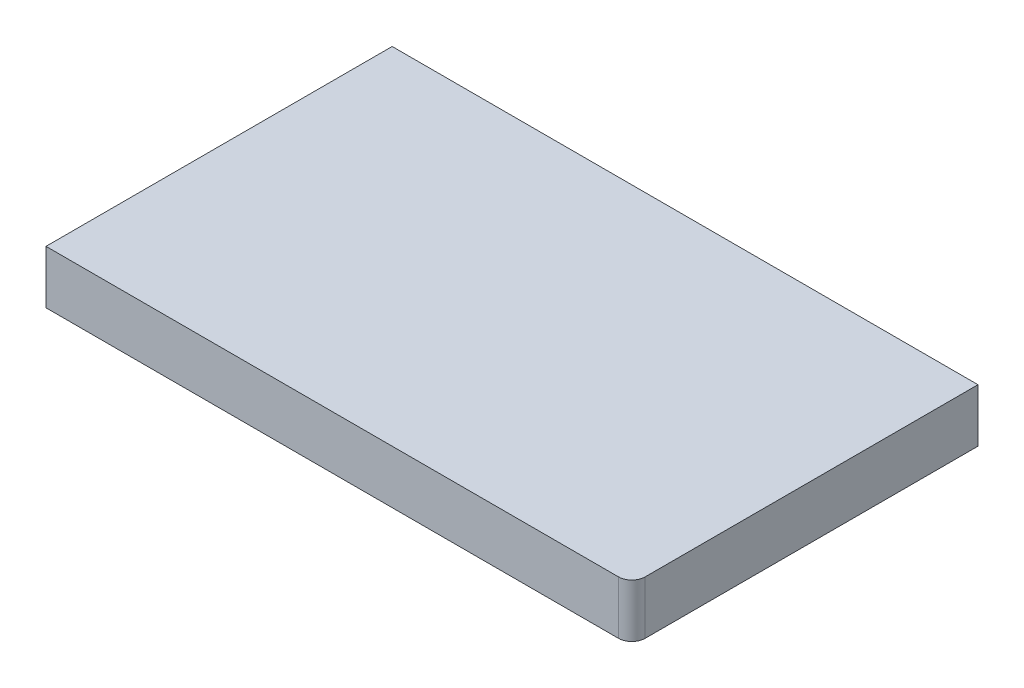
ISO-10303-21;
HEADER;
FILE_DESCRIPTION(('STEP AP214'),'2;1');
FILE_NAME('part.step','',(''),(''),'','','');
FILE_SCHEMA(('AUTOMOTIVE_DESIGN { 1 0 10303 214 1 1 1 1 }'));
ENDSEC;
DATA;
#1=APPLICATION_CONTEXT('core data for automotive mechanical design processes');
#2=APPLICATION_PROTOCOL_DEFINITION('international standard','automotive_design',2000,#1);
#3=PRODUCT_CONTEXT('',#1,'mechanical');
#4=PRODUCT('Part','Part','',(#3));
#5=PRODUCT_RELATED_PRODUCT_CATEGORY('part','',(#4));
#6=PRODUCT_DEFINITION_FORMATION('','',#4);
#7=PRODUCT_DEFINITION_CONTEXT('part definition',#1,'design');
#8=PRODUCT_DEFINITION('design','',#6,#7);
#9=PRODUCT_DEFINITION_SHAPE('','',#8);
#10=(LENGTH_UNIT() NAMED_UNIT(*) SI_UNIT(.MILLI.,.METRE.));
#11=(NAMED_UNIT(*) PLANE_ANGLE_UNIT() SI_UNIT($,.RADIAN.));
#12=(NAMED_UNIT(*) SI_UNIT($,.STERADIAN.) SOLID_ANGLE_UNIT());
#13=UNCERTAINTY_MEASURE_WITH_UNIT(LENGTH_MEASURE(1.E-05),#10,'distance_accuracy_value','');
#14=(GEOMETRIC_REPRESENTATION_CONTEXT(3) GLOBAL_UNCERTAINTY_ASSIGNED_CONTEXT((#13)) GLOBAL_UNIT_ASSIGNED_CONTEXT((#10,
#11,#12)) REPRESENTATION_CONTEXT('',''));
#15=CARTESIAN_POINT('',(0.,0.,0.));
#16=DIRECTION('',(0.,0.,1.));
#17=DIRECTION('',(1.,0.,0.));
#18=AXIS2_PLACEMENT_3D('',#15,#16,#17);
#19=CARTESIAN_POINT('',(11.,1.,6.5));
#20=DIRECTION('',(-1.,0.,0.));
#21=DIRECTION('',(0.,0.,1.));
#22=AXIS2_PLACEMENT_3D('',#19,#20,#21);
#23=PLANE('',#22);
#24=DIRECTION('',(0.,0.,-1.));
#25=VECTOR('',#24,1.);
#26=CARTESIAN_POINT('',(11.,1.,6.5));
#27=LINE('',#26,#25);
#28=CARTESIAN_POINT('',(11.,1.,6.));
#29=VERTEX_POINT('',#28);
#30=CARTESIAN_POINT('',(11.,1.,-6.5));
#31=VERTEX_POINT('',#30);
#32=EDGE_CURVE('E78',#29,#31,#27,.T.);
#33=ORIENTED_EDGE('',*,*,#32,.F.);
#34=DIRECTION('',(0.,-1.,0.));
#35=VECTOR('',#34,1.);
#36=CARTESIAN_POINT('',(11.,1.,6.));
#37=LINE('',#36,#35);
#38=CARTESIAN_POINT('',(11.,-1.,6.));
#39=VERTEX_POINT('',#38);
#40=EDGE_CURVE('E101',#29,#39,#37,.T.);
#41=ORIENTED_EDGE('',*,*,#40,.T.);
#42=DIRECTION('',(0.,0.,-1.));
#43=VECTOR('',#42,1.);
#44=CARTESIAN_POINT('',(11.,-1.,6.5));
#45=LINE('',#44,#43);
#46=CARTESIAN_POINT('',(11.,-1.,-6.5));
#47=VERTEX_POINT('',#46);
#48=EDGE_CURVE('E99',#39,#47,#45,.T.);
#49=ORIENTED_EDGE('',*,*,#48,.T.);
#50=DIRECTION('',(0.,-1.,0.));
#51=VECTOR('',#50,1.);
#52=CARTESIAN_POINT('',(11.,1.,-6.5));
#53=LINE('',#52,#51);
#54=EDGE_CURVE('E93',#31,#47,#53,.T.);
#55=ORIENTED_EDGE('',*,*,#54,.F.);
#56=EDGE_LOOP('',(#33,#41,#49,#55));
#57=FACE_BOUND('',#56,.T.);
#58=ADVANCED_FACE('F32',(#57),#23,.F.);
#59=CARTESIAN_POINT('',(-11.,1.,-6.5));
#60=DIRECTION('',(0.,0.,1.));
#61=DIRECTION('',(1.,0.,0.));
#62=AXIS2_PLACEMENT_3D('',#59,#60,#61);
#63=PLANE('',#62);
#64=DIRECTION('',(-1.,0.,0.));
#65=VECTOR('',#64,1.);
#66=CARTESIAN_POINT('',(-11.,-1.,-6.5));
#67=LINE('',#66,#65);
#68=CARTESIAN_POINT('',(-11.,-1.,-6.5));
#69=VERTEX_POINT('',#68);
#70=EDGE_CURVE('E114',#47,#69,#67,.T.);
#71=ORIENTED_EDGE('',*,*,#70,.T.);
#72=DIRECTION('',(0.,-1.,0.));
#73=VECTOR('',#72,1.);
#74=CARTESIAN_POINT('',(-11.,1.,-6.5));
#75=LINE('',#74,#73);
#76=CARTESIAN_POINT('',(-11.,1.,-6.5));
#77=VERTEX_POINT('',#76);
#78=EDGE_CURVE('E95',#77,#69,#75,.T.);
#79=ORIENTED_EDGE('',*,*,#78,.F.);
#80=DIRECTION('',(-1.,0.,0.));
#81=VECTOR('',#80,1.);
#82=CARTESIAN_POINT('',(-11.,1.,-6.5));
#83=LINE('',#82,#81);
#84=EDGE_CURVE('E81',#31,#77,#83,.T.);
#85=ORIENTED_EDGE('',*,*,#84,.F.);
#86=ORIENTED_EDGE('',*,*,#54,.T.);
#87=EDGE_LOOP('',(#71,#79,#85,#86));
#88=FACE_BOUND('',#87,.T.);
#89=ADVANCED_FACE('F92',(#88),#63,.F.);
#90=CARTESIAN_POINT('',(-11.,1.,6.5));
#91=DIRECTION('',(1.,0.,0.));
#92=DIRECTION('',(0.,0.,-1.));
#93=AXIS2_PLACEMENT_3D('',#90,#91,#92);
#94=PLANE('',#93);
#95=DIRECTION('',(0.,0.,1.));
#96=VECTOR('',#95,1.);
#97=CARTESIAN_POINT('',(-11.,-1.,6.5));
#98=LINE('',#97,#96);
#99=CARTESIAN_POINT('',(-11.,-1.,6.5));
#100=VERTEX_POINT('',#99);
#101=EDGE_CURVE('E112',#69,#100,#98,.T.);
#102=ORIENTED_EDGE('',*,*,#101,.T.);
#103=DIRECTION('',(0.,-1.,0.));
#104=VECTOR('',#103,1.);
#105=CARTESIAN_POINT('',(-11.,1.,6.5));
#106=LINE('',#105,#104);
#107=CARTESIAN_POINT('',(-11.,1.,6.5));
#108=VERTEX_POINT('',#107);
#109=EDGE_CURVE('E104',#108,#100,#106,.T.);
#110=ORIENTED_EDGE('',*,*,#109,.F.);
#111=DIRECTION('',(0.,0.,1.));
#112=VECTOR('',#111,1.);
#113=CARTESIAN_POINT('',(-11.,1.,6.5));
#114=LINE('',#113,#112);
#115=EDGE_CURVE('E97',#77,#108,#114,.T.);
#116=ORIENTED_EDGE('',*,*,#115,.F.);
#117=ORIENTED_EDGE('',*,*,#78,.T.);
#118=EDGE_LOOP('',(#102,#110,#116,#117));
#119=FACE_BOUND('',#118,.T.);
#120=ADVANCED_FACE('F120',(#119),#94,.F.);
#121=CARTESIAN_POINT('',(-11.,1.,6.5));
#122=DIRECTION('',(0.,0.,-1.));
#123=DIRECTION('',(-1.,0.,0.));
#124=AXIS2_PLACEMENT_3D('',#121,#122,#123);
#125=PLANE('',#124);
#126=DIRECTION('',(1.,0.,0.));
#127=VECTOR('',#126,1.);
#128=CARTESIAN_POINT('',(-11.,-1.,6.5));
#129=LINE('',#128,#127);
#130=CARTESIAN_POINT('',(10.5,-1.,6.5));
#131=VERTEX_POINT('',#130);
#132=EDGE_CURVE('E88',#100,#131,#129,.T.);
#133=ORIENTED_EDGE('',*,*,#132,.T.);
#134=DIRECTION('',(0.,-1.,0.));
#135=VECTOR('',#134,1.);
#136=CARTESIAN_POINT('',(10.5,1.,6.5));
#137=LINE('',#136,#135);
#138=CARTESIAN_POINT('',(10.5,1.,6.5));
#139=VERTEX_POINT('',#138);
#140=EDGE_CURVE('E40',#131,#139,#137,.F.);
#141=ORIENTED_EDGE('',*,*,#140,.T.);
#142=DIRECTION('',(1.,0.,0.));
#143=VECTOR('',#142,1.);
#144=CARTESIAN_POINT('',(-11.,1.,6.5));
#145=LINE('',#144,#143);
#146=EDGE_CURVE('E110',#108,#139,#145,.T.);
#147=ORIENTED_EDGE('',*,*,#146,.F.);
#148=ORIENTED_EDGE('',*,*,#109,.T.);
#149=EDGE_LOOP('',(#133,#141,#147,#148));
#150=FACE_BOUND('',#149,.T.);
#151=ADVANCED_FACE('F122',(#150),#125,.F.);
#152=CARTESIAN_POINT('',(0.,1.,0.));
#153=DIRECTION('',(0.,-1.,0.));
#154=DIRECTION('',(0.,0.,-1.));
#155=AXIS2_PLACEMENT_3D('',#152,#153,#154);
#156=PLANE('',#155);
#157=ORIENTED_EDGE('',*,*,#146,.T.);
#158=CARTESIAN_POINT('',(10.5,1.,6.));
#159=DIRECTION('',(0.,-1.,0.));
#160=DIRECTION('',(0.,0.,-1.));
#161=AXIS2_PLACEMENT_3D('',#158,#159,#160);
#162=CIRCLE('',#161,0.5);
#163=EDGE_CURVE('E11',#139,#29,#162,.F.);
#164=ORIENTED_EDGE('',*,*,#163,.T.);
#165=ORIENTED_EDGE('',*,*,#32,.T.);
#166=ORIENTED_EDGE('',*,*,#84,.T.);
#167=ORIENTED_EDGE('',*,*,#115,.T.);
#168=EDGE_LOOP('',(#157,#164,#165,#166,#167));
#169=FACE_BOUND('',#168,.T.);
#170=ADVANCED_FACE('F80',(#169),#156,.F.);
#171=CARTESIAN_POINT('',(0.,-1.,0.));
#172=DIRECTION('',(0.,-1.,0.));
#173=DIRECTION('',(0.,0.,-1.));
#174=AXIS2_PLACEMENT_3D('',#171,#172,#173);
#175=PLANE('',#174);
#176=ORIENTED_EDGE('',*,*,#48,.F.);
#177=CARTESIAN_POINT('',(10.5,-1.,6.));
#178=DIRECTION('',(0.,-1.,0.));
#179=DIRECTION('',(0.,0.,-1.));
#180=AXIS2_PLACEMENT_3D('',#177,#178,#179);
#181=CIRCLE('',#180,0.5);
#182=EDGE_CURVE('E54',#39,#131,#181,.T.);
#183=ORIENTED_EDGE('',*,*,#182,.T.);
#184=ORIENTED_EDGE('',*,*,#132,.F.);
#185=ORIENTED_EDGE('',*,*,#101,.F.);
#186=ORIENTED_EDGE('',*,*,#70,.F.);
#187=EDGE_LOOP('',(#176,#183,#184,#185,#186));
#188=FACE_BOUND('',#187,.T.);
#189=ADVANCED_FACE('F129',(#188),#175,.T.);
#190=CARTESIAN_POINT('',(10.5,1.,6.));
#191=DIRECTION('',(0.,-1.,0.));
#192=DIRECTION('',(0.,0.,-1.));
#193=AXIS2_PLACEMENT_3D('',#190,#191,#192);
#194=CYLINDRICAL_SURFACE('',#193,0.5);
#195=ORIENTED_EDGE('',*,*,#163,.F.);
#196=ORIENTED_EDGE('',*,*,#140,.F.);
#197=ORIENTED_EDGE('',*,*,#182,.F.);
#198=ORIENTED_EDGE('',*,*,#40,.F.);
#199=EDGE_LOOP('',(#195,#196,#197,#198));
#200=FACE_BOUND('',#199,.T.);
#201=ADVANCED_FACE('F34',(#200),#194,.T.);
#202=CLOSED_SHELL('',(#58,#89,#120,#151,#170,#189,#201));
#203=MANIFOLD_SOLID_BREP('B2',#202);
#204=ADVANCED_BREP_SHAPE_REPRESENTATION('',(#18,#203),#14);
#205=SHAPE_DEFINITION_REPRESENTATION(#9,#204);
ENDSEC;
END-ISO-10303-21;
